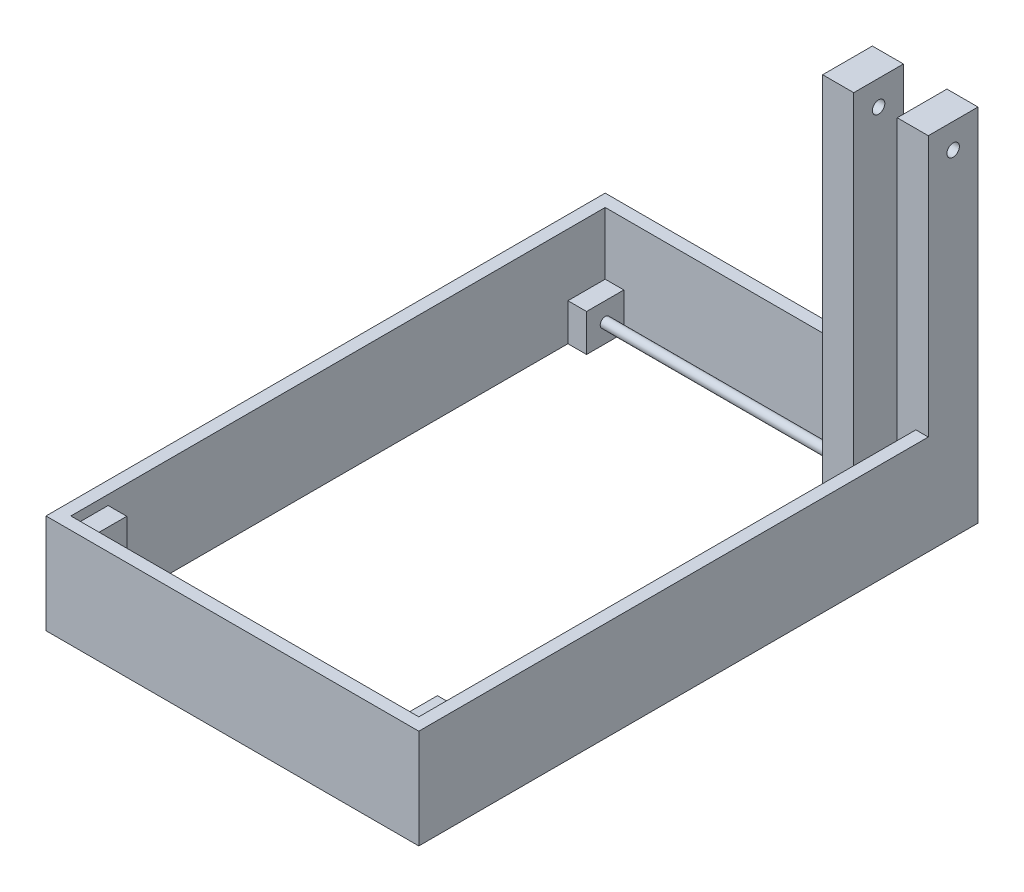
ISO-10303-21;
HEADER;
FILE_DESCRIPTION(('STEP AP214'),'2;1');
FILE_NAME('part.step','',(''),(''),'','','');
FILE_SCHEMA(('AUTOMOTIVE_DESIGN { 1 0 10303 214 1 1 1 1 }'));
ENDSEC;
DATA;
#1=APPLICATION_CONTEXT('core data for automotive mechanical design processes');
#2=APPLICATION_PROTOCOL_DEFINITION('international standard','automotive_design',2000,#1);
#3=PRODUCT_CONTEXT('',#1,'mechanical');
#4=PRODUCT('Part','Part','',(#3));
#5=PRODUCT_RELATED_PRODUCT_CATEGORY('part','',(#4));
#6=PRODUCT_DEFINITION_FORMATION('','',#4);
#7=PRODUCT_DEFINITION_CONTEXT('part definition',#1,'design');
#8=PRODUCT_DEFINITION('design','',#6,#7);
#9=PRODUCT_DEFINITION_SHAPE('','',#8);
#10=(LENGTH_UNIT() NAMED_UNIT(*) SI_UNIT(.MILLI.,.METRE.));
#11=(NAMED_UNIT(*) PLANE_ANGLE_UNIT() SI_UNIT($,.RADIAN.));
#12=(NAMED_UNIT(*) SI_UNIT($,.STERADIAN.) SOLID_ANGLE_UNIT());
#13=UNCERTAINTY_MEASURE_WITH_UNIT(LENGTH_MEASURE(1.E-05),#10,'distance_accuracy_value','');
#14=(GEOMETRIC_REPRESENTATION_CONTEXT(3) GLOBAL_UNCERTAINTY_ASSIGNED_CONTEXT((#13)) GLOBAL_UNIT_ASSIGNED_CONTEXT((#10,
#11,#12)) REPRESENTATION_CONTEXT('',''));
#15=CARTESIAN_POINT('',(0.,0.,0.));
#16=DIRECTION('',(0.,0.,1.));
#17=DIRECTION('',(1.,0.,0.));
#18=AXIS2_PLACEMENT_3D('',#15,#16,#17);
#19=CARTESIAN_POINT('',(-136.313708498985,15.,-200.));
#20=DIRECTION('',(1.,0.,0.));
#21=DIRECTION('',(0.,0.,-1.));
#22=AXIS2_PLACEMENT_3D('',#19,#20,#21);
#23=CYLINDRICAL_SURFACE('',#22,3.99999999999999);
#24=CARTESIAN_POINT('',(89.9999999999999,15.,-200.));
#25=DIRECTION('',(1.,0.,0.));
#26=DIRECTION('',(0.,0.,-1.));
#27=AXIS2_PLACEMENT_3D('',#24,#25,#26);
#28=CIRCLE('',#27,3.99999999999999);
#29=CARTESIAN_POINT('',(89.9999999999999,15.,-204.));
#30=VERTEX_POINT('',#29);
#31=EDGE_CURVE('E43',#30,#30,#28,.T.);
#32=ORIENTED_EDGE('',*,*,#31,.T.);
#33=EDGE_LOOP('',(#32));
#34=FACE_BOUND('',#33,.T.);
#35=CARTESIAN_POINT('',(125.,15.,-200.));
#36=DIRECTION('',(-1.,0.,0.));
#37=DIRECTION('',(0.,0.,1.));
#38=AXIS2_PLACEMENT_3D('',#35,#36,#37);
#39=CIRCLE('',#38,3.99999999999999);
#40=CARTESIAN_POINT('',(125.,15.,-196.));
#41=VERTEX_POINT('',#40);
#42=EDGE_CURVE('E293',#41,#41,#39,.T.);
#43=ORIENTED_EDGE('',*,*,#42,.T.);
#44=EDGE_LOOP('',(#43));
#45=FACE_BOUND('',#44,.T.);
#46=ADVANCED_FACE('F39',(#34,#45),#23,.T.);
#47=CARTESIAN_POINT('',(-150.,80.,-225.));
#48=DIRECTION('',(0.,0.,1.));
#49=DIRECTION('',(1.,0.,0.));
#50=AXIS2_PLACEMENT_3D('',#47,#48,#49);
#51=PLANE('',#50);
#52=DIRECTION('',(-1.,0.,0.));
#53=VECTOR('',#52,1.);
#54=CARTESIAN_POINT('',(-150.,0.,-225.));
#55=LINE('',#54,#53);
#56=CARTESIAN_POINT('',(150.,0.,-225.));
#57=VERTEX_POINT('',#56);
#58=CARTESIAN_POINT('',(125.,0.,-225.));
#59=VERTEX_POINT('',#58);
#60=EDGE_CURVE('E427',#57,#59,#55,.T.);
#61=ORIENTED_EDGE('',*,*,#60,.T.);
#62=DIRECTION('',(0.,1.,0.));
#63=VECTOR('',#62,1.);
#64=CARTESIAN_POINT('',(125.,-17.1699056602831,-225.));
#65=LINE('',#64,#63);
#66=CARTESIAN_POINT('',(125.,290.,-225.));
#67=VERTEX_POINT('',#66);
#68=EDGE_CURVE('E280',#59,#67,#65,.T.);
#69=ORIENTED_EDGE('',*,*,#68,.T.);
#70=DIRECTION('',(1.,0.,0.));
#71=VECTOR('',#70,1.);
#72=CARTESIAN_POINT('',(125.,290.,-225.));
#73=LINE('',#72,#71);
#74=CARTESIAN_POINT('',(150.,290.,-225.));
#75=VERTEX_POINT('',#74);
#76=EDGE_CURVE('E228',#67,#75,#73,.T.);
#77=ORIENTED_EDGE('',*,*,#76,.T.);
#78=DIRECTION('',(0.,-1.,0.));
#79=VECTOR('',#78,1.);
#80=CARTESIAN_POINT('',(150.,80.,-225.));
#81=LINE('',#80,#79);
#82=EDGE_CURVE('E446',#75,#57,#81,.T.);
#83=ORIENTED_EDGE('',*,*,#82,.T.);
#84=EDGE_LOOP('',(#61,#69,#77,#83));
#85=FACE_BOUND('',#84,.T.);
#86=ADVANCED_FACE('F499',(#85),#51,.F.);
#87=CARTESIAN_POINT('',(-150.,80.,-215.));
#88=DIRECTION('',(0.,0.,1.));
#89=DIRECTION('',(1.,0.,0.));
#90=AXIS2_PLACEMENT_3D('',#87,#88,#89);
#91=PLANE('',#90);
#92=DIRECTION('',(0.,-1.,0.));
#93=VECTOR('',#92,1.);
#94=CARTESIAN_POINT('',(64.9999999999999,80.,-215.));
#95=LINE('',#94,#93);
#96=CARTESIAN_POINT('',(64.9999999999999,80.,-215.));
#97=VERTEX_POINT('',#96);
#98=CARTESIAN_POINT('',(64.9999999999999,0.,-215.));
#99=VERTEX_POINT('',#98);
#100=EDGE_CURVE('E56',#97,#99,#95,.T.);
#101=ORIENTED_EDGE('',*,*,#100,.F.);
#102=DIRECTION('',(-1.,0.,0.));
#103=VECTOR('',#102,1.);
#104=CARTESIAN_POINT('',(-150.,80.,-215.));
#105=LINE('',#104,#103);
#106=CARTESIAN_POINT('',(-140.,80.,-215.));
#107=VERTEX_POINT('',#106);
#108=EDGE_CURVE('E403',#97,#107,#105,.T.);
#109=ORIENTED_EDGE('',*,*,#108,.T.);
#110=DIRECTION('',(0.,-1.,0.));
#111=VECTOR('',#110,1.);
#112=CARTESIAN_POINT('',(-140.,80.,-215.));
#113=LINE('',#112,#111);
#114=CARTESIAN_POINT('',(-140.,30.,-215.));
#115=VERTEX_POINT('',#114);
#116=EDGE_CURVE('E399',#107,#115,#113,.T.);
#117=ORIENTED_EDGE('',*,*,#116,.T.);
#118=DIRECTION('',(-1.,0.,0.));
#119=VECTOR('',#118,1.);
#120=CARTESIAN_POINT('',(-125.,30.,-215.));
#121=LINE('',#120,#119);
#122=CARTESIAN_POINT('',(-125.,30.,-215.));
#123=VERTEX_POINT('',#122);
#124=EDGE_CURVE('E317',#123,#115,#121,.T.);
#125=ORIENTED_EDGE('',*,*,#124,.F.);
#126=DIRECTION('',(0.,-1.,0.));
#127=VECTOR('',#126,1.);
#128=CARTESIAN_POINT('',(-125.,0.,-215.));
#129=LINE('',#128,#127);
#130=CARTESIAN_POINT('',(-125.,0.,-215.));
#131=VERTEX_POINT('',#130);
#132=EDGE_CURVE('E306',#123,#131,#129,.T.);
#133=ORIENTED_EDGE('',*,*,#132,.T.);
#134=DIRECTION('',(-1.,0.,0.));
#135=VECTOR('',#134,1.);
#136=CARTESIAN_POINT('',(-150.,0.,-215.));
#137=LINE('',#136,#135);
#138=EDGE_CURVE('E61',#99,#131,#137,.T.);
#139=ORIENTED_EDGE('',*,*,#138,.F.);
#140=EDGE_LOOP('',(#101,#109,#117,#125,#133,#139));
#141=FACE_BOUND('',#140,.T.);
#142=ADVANCED_FACE('F469',(#141),#91,.T.);
#143=CARTESIAN_POINT('',(0.,80.,0.));
#144=DIRECTION('',(0.,1.,0.));
#145=DIRECTION('',(0.,0.,1.));
#146=AXIS2_PLACEMENT_3D('',#143,#144,#145);
#147=PLANE('',#146);
#148=DIRECTION('',(0.,0.,1.));
#149=VECTOR('',#148,1.);
#150=CARTESIAN_POINT('',(64.9999999999999,80.,0.));
#151=LINE('',#150,#149);
#152=CARTESIAN_POINT('',(64.9999999999999,80.,-225.));
#153=VERTEX_POINT('',#152);
#154=EDGE_CURVE('E264',#153,#97,#151,.T.);
#155=ORIENTED_EDGE('',*,*,#154,.F.);
#156=DIRECTION('',(-1.,0.,0.));
#157=VECTOR('',#156,1.);
#158=CARTESIAN_POINT('',(-150.,80.,-225.));
#159=LINE('',#158,#157);
#160=CARTESIAN_POINT('',(-150.,80.,-225.));
#161=VERTEX_POINT('',#160);
#162=EDGE_CURVE('E431',#153,#161,#159,.T.);
#163=ORIENTED_EDGE('',*,*,#162,.T.);
#164=DIRECTION('',(0.,0.,1.));
#165=VECTOR('',#164,1.);
#166=CARTESIAN_POINT('',(-150.,80.,-225.));
#167=LINE('',#166,#165);
#168=CARTESIAN_POINT('',(-150.,80.,225.));
#169=VERTEX_POINT('',#168);
#170=EDGE_CURVE('E423',#161,#169,#167,.T.);
#171=ORIENTED_EDGE('',*,*,#170,.T.);
#172=DIRECTION('',(1.,0.,0.));
#173=VECTOR('',#172,1.);
#174=CARTESIAN_POINT('',(-150.,80.,225.));
#175=LINE('',#174,#173);
#176=CARTESIAN_POINT('',(150.,80.,225.));
#177=VERTEX_POINT('',#176);
#178=EDGE_CURVE('E426',#169,#177,#175,.T.);
#179=ORIENTED_EDGE('',*,*,#178,.T.);
#180=DIRECTION('',(0.,0.,-1.));
#181=VECTOR('',#180,1.);
#182=CARTESIAN_POINT('',(150.,80.,-225.));
#183=LINE('',#182,#181);
#184=CARTESIAN_POINT('',(150.,80.,-185.));
#185=VERTEX_POINT('',#184);
#186=EDGE_CURVE('E429',#177,#185,#183,.T.);
#187=ORIENTED_EDGE('',*,*,#186,.T.);
#188=DIRECTION('',(1.,0.,0.));
#189=VECTOR('',#188,1.);
#190=CARTESIAN_POINT('',(0.,80.,-185.));
#191=LINE('',#190,#189);
#192=CARTESIAN_POINT('',(140.,80.,-185.));
#193=VERTEX_POINT('',#192);
#194=EDGE_CURVE('E284',#193,#185,#191,.T.);
#195=ORIENTED_EDGE('',*,*,#194,.F.);
#196=DIRECTION('',(0.,0.,-1.));
#197=VECTOR('',#196,1.);
#198=CARTESIAN_POINT('',(140.,80.,-225.));
#199=LINE('',#198,#197);
#200=CARTESIAN_POINT('',(140.,80.,215.));
#201=VERTEX_POINT('',#200);
#202=EDGE_CURVE('E419',#201,#193,#199,.T.);
#203=ORIENTED_EDGE('',*,*,#202,.F.);
#204=DIRECTION('',(1.,0.,0.));
#205=VECTOR('',#204,1.);
#206=CARTESIAN_POINT('',(-150.,80.,215.));
#207=LINE('',#206,#205);
#208=CARTESIAN_POINT('',(-140.,80.,215.));
#209=VERTEX_POINT('',#208);
#210=EDGE_CURVE('E417',#209,#201,#207,.T.);
#211=ORIENTED_EDGE('',*,*,#210,.F.);
#212=DIRECTION('',(0.,0.,1.));
#213=VECTOR('',#212,1.);
#214=CARTESIAN_POINT('',(-140.,80.,-225.));
#215=LINE('',#214,#213);
#216=EDGE_CURVE('E410',#107,#209,#215,.T.);
#217=ORIENTED_EDGE('',*,*,#216,.F.);
#218=ORIENTED_EDGE('',*,*,#108,.F.);
#219=EDGE_LOOP('',(#155,#163,#171,#179,#187,#195,#203,#211,#217,#218));
#220=FACE_BOUND('',#219,.T.);
#221=ADVANCED_FACE('F464',(#220),#147,.T.);
#222=CARTESIAN_POINT('',(-140.,80.,-225.));
#223=DIRECTION('',(1.,0.,0.));
#224=DIRECTION('',(0.,0.,-1.));
#225=AXIS2_PLACEMENT_3D('',#222,#223,#224);
#226=PLANE('',#225);
#227=DIRECTION('',(0.,0.,1.));
#228=VECTOR('',#227,1.);
#229=CARTESIAN_POINT('',(-140.,0.,-225.));
#230=LINE('',#229,#228);
#231=CARTESIAN_POINT('',(-140.,0.,-185.));
#232=VERTEX_POINT('',#231);
#233=CARTESIAN_POINT('',(-140.,0.,215.));
#234=VERTEX_POINT('',#233);
#235=EDGE_CURVE('E393',#232,#234,#230,.T.);
#236=ORIENTED_EDGE('',*,*,#235,.F.);
#237=DIRECTION('',(0.,-1.,0.));
#238=VECTOR('',#237,1.);
#239=CARTESIAN_POINT('',(-140.,0.,-185.));
#240=LINE('',#239,#238);
#241=CARTESIAN_POINT('',(-140.,30.,-185.));
#242=VERTEX_POINT('',#241);
#243=EDGE_CURVE('E299',#242,#232,#240,.T.);
#244=ORIENTED_EDGE('',*,*,#243,.F.);
#245=DIRECTION('',(0.,0.,1.));
#246=VECTOR('',#245,1.);
#247=CARTESIAN_POINT('',(-140.,30.,0.));
#248=LINE('',#247,#246);
#249=EDGE_CURVE('E303',#115,#242,#248,.T.);
#250=ORIENTED_EDGE('',*,*,#249,.F.);
#251=ORIENTED_EDGE('',*,*,#116,.F.);
#252=ORIENTED_EDGE('',*,*,#216,.T.);
#253=DIRECTION('',(0.,-1.,0.));
#254=VECTOR('',#253,1.);
#255=CARTESIAN_POINT('',(-140.,80.,215.));
#256=LINE('',#255,#254);
#257=CARTESIAN_POINT('',(-140.,72.2743413073772,215.));
#258=VERTEX_POINT('',#257);
#259=EDGE_CURVE('E394',#209,#258,#256,.T.);
#260=ORIENTED_EDGE('',*,*,#259,.T.);
#261=DIRECTION('',(0.,0.,1.));
#262=VECTOR('',#261,1.);
#263=CARTESIAN_POINT('',(-140.,72.2743413073772,0.));
#264=LINE('',#263,#262);
#265=CARTESIAN_POINT('',(-140.,72.2743413073772,185.));
#266=VERTEX_POINT('',#265);
#267=EDGE_CURVE('E338',#266,#258,#264,.T.);
#268=ORIENTED_EDGE('',*,*,#267,.F.);
#269=DIRECTION('',(0.,-1.,0.));
#270=VECTOR('',#269,1.);
#271=CARTESIAN_POINT('',(-140.,0.,185.));
#272=LINE('',#271,#270);
#273=CARTESIAN_POINT('',(-140.,42.2743413073772,185.));
#274=VERTEX_POINT('',#273);
#275=EDGE_CURVE('E323',#266,#274,#272,.T.);
#276=ORIENTED_EDGE('',*,*,#275,.T.);
#277=DIRECTION('',(0.,0.,1.));
#278=VECTOR('',#277,1.);
#279=CARTESIAN_POINT('',(-140.,42.2743413073772,0.));
#280=LINE('',#279,#278);
#281=CARTESIAN_POINT('',(-140.,42.2743413073772,215.));
#282=VERTEX_POINT('',#281);
#283=EDGE_CURVE('E328',#274,#282,#280,.T.);
#284=ORIENTED_EDGE('',*,*,#283,.T.);
#285=EDGE_CURVE('E398',#282,#234,#256,.T.);
#286=ORIENTED_EDGE('',*,*,#285,.T.);
#287=EDGE_LOOP('',(#236,#244,#250,#251,#252,#260,#268,#276,#284,#286));
#288=FACE_BOUND('',#287,.T.);
#289=ADVANCED_FACE('F471',(#288),#226,.T.);
#290=CARTESIAN_POINT('',(-150.,80.,215.));
#291=DIRECTION('',(0.,0.,-1.));
#292=DIRECTION('',(-1.,0.,0.));
#293=AXIS2_PLACEMENT_3D('',#290,#291,#292);
#294=PLANE('',#293);
#295=DIRECTION('',(0.,1.,0.));
#296=VECTOR('',#295,1.);
#297=CARTESIAN_POINT('',(-125.,0.,215.));
#298=LINE('',#297,#296);
#299=CARTESIAN_POINT('',(-125.,42.2743413073772,215.));
#300=VERTEX_POINT('',#299);
#301=CARTESIAN_POINT('',(-125.,72.2743413073772,215.));
#302=VERTEX_POINT('',#301);
#303=EDGE_CURVE('E331',#300,#302,#298,.T.);
#304=ORIENTED_EDGE('',*,*,#303,.T.);
#305=DIRECTION('',(-1.,0.,0.));
#306=VECTOR('',#305,1.);
#307=CARTESIAN_POINT('',(-125.,72.2743413073772,215.));
#308=LINE('',#307,#306);
#309=EDGE_CURVE('E347',#302,#258,#308,.T.);
#310=ORIENTED_EDGE('',*,*,#309,.T.);
#311=ORIENTED_EDGE('',*,*,#259,.F.);
#312=ORIENTED_EDGE('',*,*,#210,.T.);
#313=DIRECTION('',(0.,-1.,0.));
#314=VECTOR('',#313,1.);
#315=CARTESIAN_POINT('',(140.,80.,215.));
#316=LINE('',#315,#314);
#317=CARTESIAN_POINT('',(140.,72.2743413073772,215.));
#318=VERTEX_POINT('',#317);
#319=EDGE_CURVE('E404',#201,#318,#316,.T.);
#320=ORIENTED_EDGE('',*,*,#319,.T.);
#321=DIRECTION('',(1.,0.,0.));
#322=VECTOR('',#321,1.);
#323=CARTESIAN_POINT('',(125.,72.2743413073772,215.));
#324=LINE('',#323,#322);
#325=CARTESIAN_POINT('',(125.,72.2743413073772,215.));
#326=VERTEX_POINT('',#325);
#327=EDGE_CURVE('E385',#326,#318,#324,.T.);
#328=ORIENTED_EDGE('',*,*,#327,.F.);
#329=DIRECTION('',(0.,1.,0.));
#330=VECTOR('',#329,1.);
#331=CARTESIAN_POINT('',(125.,0.,215.));
#332=LINE('',#331,#330);
#333=CARTESIAN_POINT('',(125.,42.2743413073772,215.));
#334=VERTEX_POINT('',#333);
#335=EDGE_CURVE('E370',#334,#326,#332,.T.);
#336=ORIENTED_EDGE('',*,*,#335,.F.);
#337=DIRECTION('',(1.,0.,0.));
#338=VECTOR('',#337,1.);
#339=CARTESIAN_POINT('',(125.,42.2743413073772,215.));
#340=LINE('',#339,#338);
#341=CARTESIAN_POINT('',(140.,42.2743413073772,215.));
#342=VERTEX_POINT('',#341);
#343=EDGE_CURVE('E388',#334,#342,#340,.T.);
#344=ORIENTED_EDGE('',*,*,#343,.T.);
#345=CARTESIAN_POINT('',(140.,0.,215.));
#346=VERTEX_POINT('',#345);
#347=EDGE_CURVE('E402',#342,#346,#316,.T.);
#348=ORIENTED_EDGE('',*,*,#347,.T.);
#349=DIRECTION('',(1.,0.,0.));
#350=VECTOR('',#349,1.);
#351=CARTESIAN_POINT('',(-150.,0.,215.));
#352=LINE('',#351,#350);
#353=EDGE_CURVE('E408',#234,#346,#352,.T.);
#354=ORIENTED_EDGE('',*,*,#353,.F.);
#355=ORIENTED_EDGE('',*,*,#285,.F.);
#356=DIRECTION('',(-1.,0.,0.));
#357=VECTOR('',#356,1.);
#358=CARTESIAN_POINT('',(-125.,42.2743413073772,215.));
#359=LINE('',#358,#357);
#360=EDGE_CURVE('E344',#300,#282,#359,.T.);
#361=ORIENTED_EDGE('',*,*,#360,.F.);
#362=EDGE_LOOP('',(#304,#310,#311,#312,#320,#328,#336,#344,#348,#354,#355,#361));
#363=FACE_BOUND('',#362,.T.);
#364=ADVANCED_FACE('F570',(#363),#294,.T.);
#365=CARTESIAN_POINT('',(140.,80.,-225.));
#366=DIRECTION('',(-1.,0.,0.));
#367=DIRECTION('',(0.,0.,1.));
#368=AXIS2_PLACEMENT_3D('',#365,#366,#367);
#369=PLANE('',#368);
#370=ORIENTED_EDGE('',*,*,#202,.T.);
#371=DIRECTION('',(0.,-1.,0.));
#372=VECTOR('',#371,1.);
#373=CARTESIAN_POINT('',(140.,0.,-185.));
#374=LINE('',#373,#372);
#375=CARTESIAN_POINT('',(140.,0.,-185.));
#376=VERTEX_POINT('',#375);
#377=EDGE_CURVE('E352',#193,#376,#374,.T.);
#378=ORIENTED_EDGE('',*,*,#377,.T.);
#379=DIRECTION('',(0.,0.,-1.));
#380=VECTOR('',#379,1.);
#381=CARTESIAN_POINT('',(140.,0.,-225.));
#382=LINE('',#381,#380);
#383=EDGE_CURVE('E411',#346,#376,#382,.T.);
#384=ORIENTED_EDGE('',*,*,#383,.F.);
#385=ORIENTED_EDGE('',*,*,#347,.F.);
#386=DIRECTION('',(0.,0.,1.));
#387=VECTOR('',#386,1.);
#388=CARTESIAN_POINT('',(140.,42.2743413073772,0.));
#389=LINE('',#388,#387);
#390=CARTESIAN_POINT('',(140.,42.2743413073772,185.));
#391=VERTEX_POINT('',#390);
#392=EDGE_CURVE('E379',#391,#342,#389,.T.);
#393=ORIENTED_EDGE('',*,*,#392,.F.);
#394=DIRECTION('',(0.,-1.,0.));
#395=VECTOR('',#394,1.);
#396=CARTESIAN_POINT('',(140.,0.,185.));
#397=LINE('',#396,#395);
#398=CARTESIAN_POINT('',(140.,72.2743413073772,185.));
#399=VERTEX_POINT('',#398);
#400=EDGE_CURVE('E362',#399,#391,#397,.T.);
#401=ORIENTED_EDGE('',*,*,#400,.F.);
#402=DIRECTION('',(0.,0.,1.));
#403=VECTOR('',#402,1.);
#404=CARTESIAN_POINT('',(140.,72.2743413073772,0.));
#405=LINE('',#404,#403);
#406=EDGE_CURVE('E367',#399,#318,#405,.T.);
#407=ORIENTED_EDGE('',*,*,#406,.T.);
#408=ORIENTED_EDGE('',*,*,#319,.F.);
#409=EDGE_LOOP('',(#370,#378,#384,#385,#393,#401,#407,#408));
#410=FACE_BOUND('',#409,.T.);
#411=ADVANCED_FACE('F573',(#410),#369,.T.);
#412=CARTESIAN_POINT('',(-150.,80.,-225.));
#413=DIRECTION('',(1.,0.,0.));
#414=DIRECTION('',(0.,0.,-1.));
#415=AXIS2_PLACEMENT_3D('',#412,#413,#414);
#416=PLANE('',#415);
#417=DIRECTION('',(0.,0.,1.));
#418=VECTOR('',#417,1.);
#419=CARTESIAN_POINT('',(-150.,0.,-225.));
#420=LINE('',#419,#418);
#421=CARTESIAN_POINT('',(-150.,0.,-225.));
#422=VERTEX_POINT('',#421);
#423=CARTESIAN_POINT('',(-150.,0.,225.));
#424=VERTEX_POINT('',#423);
#425=EDGE_CURVE('E397',#422,#424,#420,.T.);
#426=ORIENTED_EDGE('',*,*,#425,.T.);
#427=DIRECTION('',(0.,-1.,0.));
#428=VECTOR('',#427,1.);
#429=CARTESIAN_POINT('',(-150.,80.,225.));
#430=LINE('',#429,#428);
#431=EDGE_CURVE('E11',#169,#424,#430,.T.);
#432=ORIENTED_EDGE('',*,*,#431,.F.);
#433=ORIENTED_EDGE('',*,*,#170,.F.);
#434=DIRECTION('',(0.,-1.,0.));
#435=VECTOR('',#434,1.);
#436=CARTESIAN_POINT('',(-150.,80.,-225.));
#437=LINE('',#436,#435);
#438=EDGE_CURVE('E433',#161,#422,#437,.T.);
#439=ORIENTED_EDGE('',*,*,#438,.T.);
#440=EDGE_LOOP('',(#426,#432,#433,#439));
#441=FACE_BOUND('',#440,.T.);
#442=ADVANCED_FACE('F41',(#441),#416,.F.);
#443=CARTESIAN_POINT('',(-150.,80.,225.));
#444=DIRECTION('',(0.,0.,-1.));
#445=DIRECTION('',(-1.,0.,0.));
#446=AXIS2_PLACEMENT_3D('',#443,#444,#445);
#447=PLANE('',#446);
#448=DIRECTION('',(1.,0.,0.));
#449=VECTOR('',#448,1.);
#450=CARTESIAN_POINT('',(-150.,0.,225.));
#451=LINE('',#450,#449);
#452=CARTESIAN_POINT('',(150.,0.,225.));
#453=VERTEX_POINT('',#452);
#454=EDGE_CURVE('E436',#424,#453,#451,.T.);
#455=ORIENTED_EDGE('',*,*,#454,.T.);
#456=DIRECTION('',(0.,-1.,0.));
#457=VECTOR('',#456,1.);
#458=CARTESIAN_POINT('',(150.,80.,225.));
#459=LINE('',#458,#457);
#460=EDGE_CURVE('E48',#177,#453,#459,.T.);
#461=ORIENTED_EDGE('',*,*,#460,.F.);
#462=ORIENTED_EDGE('',*,*,#178,.F.);
#463=ORIENTED_EDGE('',*,*,#431,.T.);
#464=EDGE_LOOP('',(#455,#461,#462,#463));
#465=FACE_BOUND('',#464,.T.);
#466=ADVANCED_FACE('F587',(#465),#447,.F.);
#467=CARTESIAN_POINT('',(150.,80.,-225.));
#468=DIRECTION('',(-1.,0.,0.));
#469=DIRECTION('',(0.,0.,1.));
#470=AXIS2_PLACEMENT_3D('',#467,#468,#469);
#471=PLANE('',#470);
#472=CARTESIAN_POINT('',(150.,270.,-205.));
#473=DIRECTION('',(-1.,0.,0.));
#474=DIRECTION('',(0.,0.,1.));
#475=AXIS2_PLACEMENT_3D('',#472,#473,#474);
#476=CIRCLE('',#475,4.99999999999999);
#477=CARTESIAN_POINT('',(150.,270.,-200.));
#478=VERTEX_POINT('',#477);
#479=EDGE_CURVE('E244',#478,#478,#476,.T.);
#480=ORIENTED_EDGE('',*,*,#479,.T.);
#481=EDGE_LOOP('',(#480));
#482=FACE_BOUND('',#481,.T.);
#483=DIRECTION('',(0.,1.,0.));
#484=VECTOR('',#483,1.);
#485=CARTESIAN_POINT('',(150.,-17.1699056602831,-185.));
#486=LINE('',#485,#484);
#487=CARTESIAN_POINT('',(150.,290.,-185.));
#488=VERTEX_POINT('',#487);
#489=EDGE_CURVE('E282',#185,#488,#486,.T.);
#490=ORIENTED_EDGE('',*,*,#489,.F.);
#491=ORIENTED_EDGE('',*,*,#186,.F.);
#492=ORIENTED_EDGE('',*,*,#460,.T.);
#493=DIRECTION('',(0.,0.,-1.));
#494=VECTOR('',#493,1.);
#495=CARTESIAN_POINT('',(150.,0.,-225.));
#496=LINE('',#495,#494);
#497=EDGE_CURVE('E438',#453,#57,#496,.T.);
#498=ORIENTED_EDGE('',*,*,#497,.T.);
#499=ORIENTED_EDGE('',*,*,#82,.F.);
#500=DIRECTION('',(0.,0.,-1.));
#501=VECTOR('',#500,1.);
#502=CARTESIAN_POINT('',(150.,290.,-185.));
#503=LINE('',#502,#501);
#504=EDGE_CURVE('E271',#488,#75,#503,.T.);
#505=ORIENTED_EDGE('',*,*,#504,.F.);
#506=EDGE_LOOP('',(#490,#491,#492,#498,#499,#505));
#507=FACE_BOUND('',#506,.T.);
#508=ADVANCED_FACE('F585',(#482,#507),#471,.F.);
#509=ORIENTED_EDGE('',*,*,#162,.F.);
#510=DIRECTION('',(0.,1.,0.));
#511=VECTOR('',#510,1.);
#512=CARTESIAN_POINT('',(64.9999999999999,-47.169905660283,-225.));
#513=LINE('',#512,#511);
#514=CARTESIAN_POINT('',(64.9999999999999,290.,-225.));
#515=VERTEX_POINT('',#514);
#516=EDGE_CURVE('E234',#153,#515,#513,.T.);
#517=ORIENTED_EDGE('',*,*,#516,.T.);
#518=DIRECTION('',(-1.,0.,0.));
#519=VECTOR('',#518,1.);
#520=CARTESIAN_POINT('',(89.9999999999999,290.,-225.));
#521=LINE('',#520,#519);
#522=CARTESIAN_POINT('',(89.9999999999999,290.,-225.));
#523=VERTEX_POINT('',#522);
#524=EDGE_CURVE('E231',#523,#515,#521,.T.);
#525=ORIENTED_EDGE('',*,*,#524,.F.);
#526=DIRECTION('',(0.,-1.,0.));
#527=VECTOR('',#526,1.);
#528=CARTESIAN_POINT('',(90.,80.,-225.));
#529=LINE('',#528,#527);
#530=CARTESIAN_POINT('',(90.,0.,-225.));
#531=VERTEX_POINT('',#530);
#532=EDGE_CURVE('E218',#523,#531,#529,.T.);
#533=ORIENTED_EDGE('',*,*,#532,.T.);
#534=EDGE_CURVE('E441',#531,#422,#55,.T.);
#535=ORIENTED_EDGE('',*,*,#534,.T.);
#536=ORIENTED_EDGE('',*,*,#438,.F.);
#537=EDGE_LOOP('',(#509,#517,#525,#533,#535,#536));
#538=FACE_BOUND('',#537,.T.);
#539=ADVANCED_FACE('F232',(#538),#51,.F.);
#540=CARTESIAN_POINT('',(0.,0.,0.));
#541=DIRECTION('',(0.,1.,0.));
#542=DIRECTION('',(0.,0.,1.));
#543=AXIS2_PLACEMENT_3D('',#540,#541,#542);
#544=PLANE('',#543);
#545=ORIENTED_EDGE('',*,*,#425,.F.);
#546=ORIENTED_EDGE('',*,*,#534,.F.);
#547=DIRECTION('',(0.,0.,1.));
#548=VECTOR('',#547,1.);
#549=CARTESIAN_POINT('',(90.,0.,-515.));
#550=LINE('',#549,#548);
#551=CARTESIAN_POINT('',(89.9999999999999,0.,-185.));
#552=VERTEX_POINT('',#551);
#553=EDGE_CURVE('E225',#531,#552,#550,.T.);
#554=ORIENTED_EDGE('',*,*,#553,.T.);
#555=DIRECTION('',(-1.,0.,0.));
#556=VECTOR('',#555,1.);
#557=CARTESIAN_POINT('',(89.9999999999999,0.,-185.));
#558=LINE('',#557,#556);
#559=CARTESIAN_POINT('',(64.9999999999999,0.,-185.));
#560=VERTEX_POINT('',#559);
#561=EDGE_CURVE('E256',#552,#560,#558,.T.);
#562=ORIENTED_EDGE('',*,*,#561,.T.);
#563=DIRECTION('',(0.,0.,-1.));
#564=VECTOR('',#563,1.);
#565=CARTESIAN_POINT('',(64.9999999999999,0.,-225.));
#566=LINE('',#565,#564);
#567=EDGE_CURVE('E253',#560,#99,#566,.T.);
#568=ORIENTED_EDGE('',*,*,#567,.T.);
#569=ORIENTED_EDGE('',*,*,#138,.T.);
#570=DIRECTION('',(0.,0.,1.));
#571=VECTOR('',#570,1.);
#572=CARTESIAN_POINT('',(-125.,0.,0.));
#573=LINE('',#572,#571);
#574=CARTESIAN_POINT('',(-125.,0.,-185.));
#575=VERTEX_POINT('',#574);
#576=EDGE_CURVE('E302',#131,#575,#573,.T.);
#577=ORIENTED_EDGE('',*,*,#576,.T.);
#578=DIRECTION('',(-1.,0.,0.));
#579=VECTOR('',#578,1.);
#580=CARTESIAN_POINT('',(-125.,0.,-185.));
#581=LINE('',#580,#579);
#582=EDGE_CURVE('E320',#575,#232,#581,.T.);
#583=ORIENTED_EDGE('',*,*,#582,.T.);
#584=ORIENTED_EDGE('',*,*,#235,.T.);
#585=ORIENTED_EDGE('',*,*,#353,.T.);
#586=ORIENTED_EDGE('',*,*,#383,.T.);
#587=DIRECTION('',(1.,0.,0.));
#588=VECTOR('',#587,1.);
#589=CARTESIAN_POINT('',(125.,0.,-185.));
#590=LINE('',#589,#588);
#591=CARTESIAN_POINT('',(125.,0.,-185.));
#592=VERTEX_POINT('',#591);
#593=EDGE_CURVE('E358',#592,#376,#590,.T.);
#594=ORIENTED_EDGE('',*,*,#593,.F.);
#595=DIRECTION('',(0.,0.,1.));
#596=VECTOR('',#595,1.);
#597=CARTESIAN_POINT('',(125.,0.,0.));
#598=LINE('',#597,#596);
#599=EDGE_CURVE('E356',#59,#592,#598,.T.);
#600=ORIENTED_EDGE('',*,*,#599,.F.);
#601=ORIENTED_EDGE('',*,*,#60,.F.);
#602=ORIENTED_EDGE('',*,*,#497,.F.);
#603=ORIENTED_EDGE('',*,*,#454,.F.);
#604=EDGE_LOOP('',(#545,#546,#554,#562,#568,#569,#577,#583,#584,#585,#586,#594,#600,#601,#602,#603));
#605=FACE_BOUND('',#604,.T.);
#606=ADVANCED_FACE('F487',(#605),#544,.F.);
#607=CARTESIAN_POINT('',(125.,0.,185.));
#608=DIRECTION('',(0.,0.,1.));
#609=DIRECTION('',(1.,0.,0.));
#610=AXIS2_PLACEMENT_3D('',#607,#608,#609);
#611=PLANE('',#610);
#612=ORIENTED_EDGE('',*,*,#400,.T.);
#613=DIRECTION('',(1.,0.,0.));
#614=VECTOR('',#613,1.);
#615=CARTESIAN_POINT('',(125.,42.2743413073772,185.));
#616=LINE('',#615,#614);
#617=CARTESIAN_POINT('',(125.,42.2743413073772,185.));
#618=VERTEX_POINT('',#617);
#619=EDGE_CURVE('E390',#618,#391,#616,.T.);
#620=ORIENTED_EDGE('',*,*,#619,.F.);
#621=DIRECTION('',(0.,-1.,0.));
#622=VECTOR('',#621,1.);
#623=CARTESIAN_POINT('',(125.,0.,185.));
#624=LINE('',#623,#622);
#625=CARTESIAN_POINT('',(125.,72.2743413073772,185.));
#626=VERTEX_POINT('',#625);
#627=EDGE_CURVE('E363',#626,#618,#624,.T.);
#628=ORIENTED_EDGE('',*,*,#627,.F.);
#629=DIRECTION('',(1.,0.,0.));
#630=VECTOR('',#629,1.);
#631=CARTESIAN_POINT('',(125.,72.2743413073772,185.));
#632=LINE('',#631,#630);
#633=EDGE_CURVE('E376',#626,#399,#632,.T.);
#634=ORIENTED_EDGE('',*,*,#633,.T.);
#635=EDGE_LOOP('',(#612,#620,#628,#634));
#636=FACE_BOUND('',#635,.T.);
#637=ADVANCED_FACE('F563',(#636),#611,.F.);
#638=CARTESIAN_POINT('',(125.,42.2743413073772,0.));
#639=DIRECTION('',(0.,1.,0.));
#640=DIRECTION('',(0.,0.,1.));
#641=AXIS2_PLACEMENT_3D('',#638,#639,#640);
#642=PLANE('',#641);
#643=ORIENTED_EDGE('',*,*,#392,.T.);
#644=ORIENTED_EDGE('',*,*,#343,.F.);
#645=DIRECTION('',(0.,0.,1.));
#646=VECTOR('',#645,1.);
#647=CARTESIAN_POINT('',(125.,42.2743413073772,0.));
#648=LINE('',#647,#646);
#649=EDGE_CURVE('E366',#618,#334,#648,.T.);
#650=ORIENTED_EDGE('',*,*,#649,.F.);
#651=ORIENTED_EDGE('',*,*,#619,.T.);
#652=EDGE_LOOP('',(#643,#644,#650,#651));
#653=FACE_BOUND('',#652,.T.);
#654=ADVANCED_FACE('F559',(#653),#642,.F.);
#655=CARTESIAN_POINT('',(125.,72.2743413073772,0.));
#656=DIRECTION('',(0.,1.,0.));
#657=DIRECTION('',(0.,0.,1.));
#658=AXIS2_PLACEMENT_3D('',#655,#656,#657);
#659=PLANE('',#658);
#660=ORIENTED_EDGE('',*,*,#406,.F.);
#661=ORIENTED_EDGE('',*,*,#633,.F.);
#662=DIRECTION('',(0.,0.,1.));
#663=VECTOR('',#662,1.);
#664=CARTESIAN_POINT('',(125.,72.2743413073772,0.));
#665=LINE('',#664,#663);
#666=EDGE_CURVE('E373',#626,#326,#665,.T.);
#667=ORIENTED_EDGE('',*,*,#666,.T.);
#668=ORIENTED_EDGE('',*,*,#327,.T.);
#669=EDGE_LOOP('',(#660,#661,#667,#668));
#670=FACE_BOUND('',#669,.T.);
#671=ADVANCED_FACE('F555',(#670),#659,.T.);
#672=CARTESIAN_POINT('',(125.,0.,0.));
#673=DIRECTION('',(-1.,0.,0.));
#674=DIRECTION('',(0.,0.,1.));
#675=AXIS2_PLACEMENT_3D('',#672,#673,#674);
#676=PLANE('',#675);
#677=CARTESIAN_POINT('',(125.,57.2743413073772,200.));
#678=DIRECTION('',(-1.,0.,0.));
#679=DIRECTION('',(0.,0.,1.));
#680=AXIS2_PLACEMENT_3D('',#677,#678,#679);
#681=CIRCLE('',#680,3.99999999999999);
#682=CARTESIAN_POINT('',(125.,57.2743413073772,204.));
#683=VERTEX_POINT('',#682);
#684=EDGE_CURVE('E287',#683,#683,#681,.T.);
#685=ORIENTED_EDGE('',*,*,#684,.F.);
#686=EDGE_LOOP('',(#685));
#687=FACE_BOUND('',#686,.T.);
#688=ORIENTED_EDGE('',*,*,#627,.T.);
#689=ORIENTED_EDGE('',*,*,#649,.T.);
#690=ORIENTED_EDGE('',*,*,#335,.T.);
#691=ORIENTED_EDGE('',*,*,#666,.F.);
#692=EDGE_LOOP('',(#688,#689,#690,#691));
#693=FACE_BOUND('',#692,.T.);
#694=ADVANCED_FACE('F551',(#687,#693),#676,.T.);
#695=CARTESIAN_POINT('',(125.,0.,-185.));
#696=DIRECTION('',(0.,0.,1.));
#697=DIRECTION('',(1.,0.,0.));
#698=AXIS2_PLACEMENT_3D('',#695,#696,#697);
#699=PLANE('',#698);
#700=ORIENTED_EDGE('',*,*,#377,.F.);
#701=ORIENTED_EDGE('',*,*,#194,.T.);
#702=ORIENTED_EDGE('',*,*,#489,.T.);
#703=DIRECTION('',(1.,0.,0.));
#704=VECTOR('',#703,1.);
#705=CARTESIAN_POINT('',(125.,290.,-185.));
#706=LINE('',#705,#704);
#707=CARTESIAN_POINT('',(125.,290.,-185.));
#708=VERTEX_POINT('',#707);
#709=EDGE_CURVE('E274',#708,#488,#706,.T.);
#710=ORIENTED_EDGE('',*,*,#709,.F.);
#711=DIRECTION('',(0.,-1.,0.));
#712=VECTOR('',#711,1.);
#713=CARTESIAN_POINT('',(125.,0.,-185.));
#714=LINE('',#713,#712);
#715=EDGE_CURVE('E353',#708,#592,#714,.T.);
#716=ORIENTED_EDGE('',*,*,#715,.T.);
#717=ORIENTED_EDGE('',*,*,#593,.T.);
#718=EDGE_LOOP('',(#700,#701,#702,#710,#716,#717));
#719=FACE_BOUND('',#718,.T.);
#720=ADVANCED_FACE('F547',(#719),#699,.T.);
#721=CARTESIAN_POINT('',(125.,0.,0.));
#722=DIRECTION('',(-1.,0.,0.));
#723=DIRECTION('',(0.,0.,1.));
#724=AXIS2_PLACEMENT_3D('',#721,#722,#723);
#725=PLANE('',#724);
#726=CARTESIAN_POINT('',(125.,270.,-205.));
#727=DIRECTION('',(-1.,0.,0.));
#728=DIRECTION('',(0.,0.,1.));
#729=AXIS2_PLACEMENT_3D('',#726,#727,#728);
#730=CIRCLE('',#729,4.99999999999999);
#731=CARTESIAN_POINT('',(125.,270.,-200.));
#732=VERTEX_POINT('',#731);
#733=EDGE_CURVE('E247',#732,#732,#730,.T.);
#734=ORIENTED_EDGE('',*,*,#733,.F.);
#735=EDGE_LOOP('',(#734));
#736=FACE_BOUND('',#735,.T.);
#737=ORIENTED_EDGE('',*,*,#68,.F.);
#738=ORIENTED_EDGE('',*,*,#599,.T.);
#739=ORIENTED_EDGE('',*,*,#715,.F.);
#740=DIRECTION('',(0.,0.,-1.));
#741=VECTOR('',#740,1.);
#742=CARTESIAN_POINT('',(125.,290.,-185.));
#743=LINE('',#742,#741);
#744=EDGE_CURVE('E277',#708,#67,#743,.T.);
#745=ORIENTED_EDGE('',*,*,#744,.T.);
#746=EDGE_LOOP('',(#737,#738,#739,#745));
#747=FACE_BOUND('',#746,.T.);
#748=ORIENTED_EDGE('',*,*,#42,.F.);
#749=EDGE_LOOP('',(#748));
#750=FACE_BOUND('',#749,.T.);
#751=ADVANCED_FACE('F543',(#736,#747,#750),#725,.T.);
#752=CARTESIAN_POINT('',(-125.,0.,185.));
#753=DIRECTION('',(0.,0.,-1.));
#754=DIRECTION('',(-1.,0.,0.));
#755=AXIS2_PLACEMENT_3D('',#752,#753,#754);
#756=PLANE('',#755);
#757=ORIENTED_EDGE('',*,*,#275,.F.);
#758=DIRECTION('',(-1.,0.,0.));
#759=VECTOR('',#758,1.);
#760=CARTESIAN_POINT('',(-125.,72.2743413073772,185.));
#761=LINE('',#760,#759);
#762=CARTESIAN_POINT('',(-125.,72.2743413073772,185.));
#763=VERTEX_POINT('',#762);
#764=EDGE_CURVE('E349',#763,#266,#761,.T.);
#765=ORIENTED_EDGE('',*,*,#764,.F.);
#766=DIRECTION('',(0.,-1.,0.));
#767=VECTOR('',#766,1.);
#768=CARTESIAN_POINT('',(-125.,0.,185.));
#769=LINE('',#768,#767);
#770=CARTESIAN_POINT('',(-125.,42.2743413073772,185.));
#771=VERTEX_POINT('',#770);
#772=EDGE_CURVE('E324',#763,#771,#769,.T.);
#773=ORIENTED_EDGE('',*,*,#772,.T.);
#774=DIRECTION('',(-1.,0.,0.));
#775=VECTOR('',#774,1.);
#776=CARTESIAN_POINT('',(-125.,42.2743413073772,185.));
#777=LINE('',#776,#775);
#778=EDGE_CURVE('E336',#771,#274,#777,.T.);
#779=ORIENTED_EDGE('',*,*,#778,.T.);
#780=EDGE_LOOP('',(#757,#765,#773,#779));
#781=FACE_BOUND('',#780,.T.);
#782=ADVANCED_FACE('F539',(#781),#756,.T.);
#783=CARTESIAN_POINT('',(-125.,72.2743413073772,0.));
#784=DIRECTION('',(0.,-1.,0.));
#785=DIRECTION('',(0.,0.,-1.));
#786=AXIS2_PLACEMENT_3D('',#783,#784,#785);
#787=PLANE('',#786);
#788=ORIENTED_EDGE('',*,*,#267,.T.);
#789=ORIENTED_EDGE('',*,*,#309,.F.);
#790=DIRECTION('',(0.,0.,1.));
#791=VECTOR('',#790,1.);
#792=CARTESIAN_POINT('',(-125.,72.2743413073772,0.));
#793=LINE('',#792,#791);
#794=EDGE_CURVE('E327',#763,#302,#793,.T.);
#795=ORIENTED_EDGE('',*,*,#794,.F.);
#796=ORIENTED_EDGE('',*,*,#764,.T.);
#797=EDGE_LOOP('',(#788,#789,#795,#796));
#798=FACE_BOUND('',#797,.T.);
#799=ADVANCED_FACE('F535',(#798),#787,.F.);
#800=CARTESIAN_POINT('',(-125.,42.2743413073772,0.));
#801=DIRECTION('',(0.,-1.,0.));
#802=DIRECTION('',(0.,0.,-1.));
#803=AXIS2_PLACEMENT_3D('',#800,#801,#802);
#804=PLANE('',#803);
#805=ORIENTED_EDGE('',*,*,#283,.F.);
#806=ORIENTED_EDGE('',*,*,#778,.F.);
#807=DIRECTION('',(0.,0.,1.));
#808=VECTOR('',#807,1.);
#809=CARTESIAN_POINT('',(-125.,42.2743413073772,0.));
#810=LINE('',#809,#808);
#811=EDGE_CURVE('E333',#771,#300,#810,.T.);
#812=ORIENTED_EDGE('',*,*,#811,.T.);
#813=ORIENTED_EDGE('',*,*,#360,.T.);
#814=EDGE_LOOP('',(#805,#806,#812,#813));
#815=FACE_BOUND('',#814,.T.);
#816=ADVANCED_FACE('F531',(#815),#804,.T.);
#817=CARTESIAN_POINT('',(-125.,0.,0.));
#818=DIRECTION('',(1.,0.,0.));
#819=DIRECTION('',(0.,0.,1.));
#820=AXIS2_PLACEMENT_3D('',#817,#818,#819);
#821=PLANE('',#820);
#822=CARTESIAN_POINT('',(-125.,57.2743413073772,200.));
#823=DIRECTION('',(1.,0.,0.));
#824=DIRECTION('',(0.,0.,-1.));
#825=AXIS2_PLACEMENT_3D('',#822,#823,#824);
#826=CIRCLE('',#825,3.99999999999999);
#827=CARTESIAN_POINT('',(-125.,57.2743413073772,196.));
#828=VERTEX_POINT('',#827);
#829=EDGE_CURVE('E290',#828,#828,#826,.T.);
#830=ORIENTED_EDGE('',*,*,#829,.F.);
#831=EDGE_LOOP('',(#830));
#832=FACE_BOUND('',#831,.T.);
#833=ORIENTED_EDGE('',*,*,#772,.F.);
#834=ORIENTED_EDGE('',*,*,#794,.T.);
#835=ORIENTED_EDGE('',*,*,#303,.F.);
#836=ORIENTED_EDGE('',*,*,#811,.F.);
#837=EDGE_LOOP('',(#833,#834,#835,#836));
#838=FACE_BOUND('',#837,.T.);
#839=ADVANCED_FACE('F528',(#832,#838),#821,.T.);
#840=CARTESIAN_POINT('',(-125.,0.,-185.));
#841=DIRECTION('',(0.,0.,-1.));
#842=DIRECTION('',(-1.,0.,0.));
#843=AXIS2_PLACEMENT_3D('',#840,#841,#842);
#844=PLANE('',#843);
#845=ORIENTED_EDGE('',*,*,#243,.T.);
#846=ORIENTED_EDGE('',*,*,#582,.F.);
#847=DIRECTION('',(0.,-1.,0.));
#848=VECTOR('',#847,1.);
#849=CARTESIAN_POINT('',(-125.,0.,-185.));
#850=LINE('',#849,#848);
#851=CARTESIAN_POINT('',(-125.,30.,-185.));
#852=VERTEX_POINT('',#851);
#853=EDGE_CURVE('E300',#852,#575,#850,.T.);
#854=ORIENTED_EDGE('',*,*,#853,.F.);
#855=DIRECTION('',(-1.,0.,0.));
#856=VECTOR('',#855,1.);
#857=CARTESIAN_POINT('',(-125.,30.,-185.));
#858=LINE('',#857,#856);
#859=EDGE_CURVE('E310',#852,#242,#858,.T.);
#860=ORIENTED_EDGE('',*,*,#859,.T.);
#861=EDGE_LOOP('',(#845,#846,#854,#860));
#862=FACE_BOUND('',#861,.T.);
#863=ADVANCED_FACE('F479',(#862),#844,.F.);
#864=CARTESIAN_POINT('',(-125.,30.,0.));
#865=DIRECTION('',(0.,-1.,0.));
#866=DIRECTION('',(0.,0.,-1.));
#867=AXIS2_PLACEMENT_3D('',#864,#865,#866);
#868=PLANE('',#867);
#869=ORIENTED_EDGE('',*,*,#249,.T.);
#870=ORIENTED_EDGE('',*,*,#859,.F.);
#871=DIRECTION('',(0.,0.,1.));
#872=VECTOR('',#871,1.);
#873=CARTESIAN_POINT('',(-125.,30.,0.));
#874=LINE('',#873,#872);
#875=EDGE_CURVE('E308',#123,#852,#874,.T.);
#876=ORIENTED_EDGE('',*,*,#875,.F.);
#877=ORIENTED_EDGE('',*,*,#124,.T.);
#878=EDGE_LOOP('',(#869,#870,#876,#877));
#879=FACE_BOUND('',#878,.T.);
#880=ADVANCED_FACE('F475',(#879),#868,.F.);
#881=CARTESIAN_POINT('',(-125.,0.,0.));
#882=DIRECTION('',(1.,0.,0.));
#883=DIRECTION('',(0.,0.,1.));
#884=AXIS2_PLACEMENT_3D('',#881,#882,#883);
#885=PLANE('',#884);
#886=CARTESIAN_POINT('',(-125.,15.,-200.));
#887=DIRECTION('',(1.,0.,0.));
#888=DIRECTION('',(0.,0.,-1.));
#889=AXIS2_PLACEMENT_3D('',#886,#887,#888);
#890=CIRCLE('',#889,3.99999999999999);
#891=CARTESIAN_POINT('',(-125.,15.,-204.));
#892=VERTEX_POINT('',#891);
#893=EDGE_CURVE('E296',#892,#892,#890,.T.);
#894=ORIENTED_EDGE('',*,*,#893,.F.);
#895=EDGE_LOOP('',(#894));
#896=FACE_BOUND('',#895,.T.);
#897=ORIENTED_EDGE('',*,*,#853,.T.);
#898=ORIENTED_EDGE('',*,*,#576,.F.);
#899=ORIENTED_EDGE('',*,*,#132,.F.);
#900=ORIENTED_EDGE('',*,*,#875,.T.);
#901=EDGE_LOOP('',(#897,#898,#899,#900));
#902=FACE_BOUND('',#901,.T.);
#903=ADVANCED_FACE('F483',(#896,#902),#885,.T.);
#904=CARTESIAN_POINT('',(64.9999999999999,15.,-200.));
#905=DIRECTION('',(-1.,0.,0.));
#906=DIRECTION('',(0.,0.,1.));
#907=AXIS2_PLACEMENT_3D('',#904,#905,#906);
#908=CIRCLE('',#907,3.99999999999999);
#909=CARTESIAN_POINT('',(64.9999999999999,15.,-196.));
#910=VERTEX_POINT('',#909);
#911=EDGE_CURVE('E259',#910,#910,#908,.T.);
#912=ORIENTED_EDGE('',*,*,#911,.T.);
#913=EDGE_LOOP('',(#912));
#914=FACE_BOUND('',#913,.T.);
#915=ORIENTED_EDGE('',*,*,#893,.T.);
#916=EDGE_LOOP('',(#915));
#917=FACE_BOUND('',#916,.T.);
#918=ADVANCED_FACE('F452',(#914,#917),#23,.T.);
#919=CARTESIAN_POINT('',(-136.313708498985,57.2743413073772,200.));
#920=DIRECTION('',(1.,0.,0.));
#921=DIRECTION('',(0.,0.,-1.));
#922=AXIS2_PLACEMENT_3D('',#919,#920,#921);
#923=CYLINDRICAL_SURFACE('',#922,3.99999999999999);
#924=ORIENTED_EDGE('',*,*,#829,.T.);
#925=EDGE_LOOP('',(#924));
#926=FACE_BOUND('',#925,.T.);
#927=ORIENTED_EDGE('',*,*,#684,.T.);
#928=EDGE_LOOP('',(#927));
#929=FACE_BOUND('',#928,.T.);
#930=ADVANCED_FACE('F512',(#926,#929),#923,.T.);
#931=CARTESIAN_POINT('',(0.,290.,0.));
#932=DIRECTION('',(0.,1.,0.));
#933=DIRECTION('',(0.,0.,1.));
#934=AXIS2_PLACEMENT_3D('',#931,#932,#933);
#935=PLANE('',#934);
#936=ORIENTED_EDGE('',*,*,#76,.F.);
#937=ORIENTED_EDGE('',*,*,#744,.F.);
#938=ORIENTED_EDGE('',*,*,#709,.T.);
#939=ORIENTED_EDGE('',*,*,#504,.T.);
#940=EDGE_LOOP('',(#936,#937,#938,#939));
#941=FACE_BOUND('',#940,.T.);
#942=ADVANCED_FACE('F517',(#941),#935,.T.);
#943=CARTESIAN_POINT('',(90.,0.,-515.));
#944=DIRECTION('',(-1.,0.,0.));
#945=DIRECTION('',(0.,-1.,0.));
#946=AXIS2_PLACEMENT_3D('',#943,#944,#945);
#947=PLANE('',#946);
#948=CARTESIAN_POINT('',(89.9999999999999,270.,-205.));
#949=DIRECTION('',(-1.,0.,0.));
#950=DIRECTION('',(0.,-1.,0.));
#951=AXIS2_PLACEMENT_3D('',#948,#949,#950);
#952=CIRCLE('',#951,4.99999999999999);
#953=CARTESIAN_POINT('',(89.9999999999999,265.,-205.));
#954=VERTEX_POINT('',#953);
#955=EDGE_CURVE('E646',#954,#954,#952,.T.);
#956=ORIENTED_EDGE('',*,*,#955,.T.);
#957=EDGE_LOOP('',(#956));
#958=FACE_BOUND('',#957,.T.);
#959=DIRECTION('',(0.,1.,0.));
#960=VECTOR('',#959,1.);
#961=CARTESIAN_POINT('',(89.9999999999999,-47.169905660283,-185.));
#962=LINE('',#961,#960);
#963=CARTESIAN_POINT('',(89.9999999999999,290.,-185.));
#964=VERTEX_POINT('',#963);
#965=EDGE_CURVE('E257',#552,#964,#962,.T.);
#966=ORIENTED_EDGE('',*,*,#965,.F.);
#967=ORIENTED_EDGE('',*,*,#553,.F.);
#968=ORIENTED_EDGE('',*,*,#532,.F.);
#969=DIRECTION('',(0.,0.,-1.));
#970=VECTOR('',#969,1.);
#971=CARTESIAN_POINT('',(89.9999999999999,290.,-225.));
#972=LINE('',#971,#970);
#973=EDGE_CURVE('E224',#964,#523,#972,.T.);
#974=ORIENTED_EDGE('',*,*,#973,.F.);
#975=EDGE_LOOP('',(#966,#967,#968,#974));
#976=FACE_BOUND('',#975,.T.);
#977=ORIENTED_EDGE('',*,*,#31,.F.);
#978=EDGE_LOOP('',(#977));
#979=FACE_BOUND('',#978,.T.);
#980=ADVANCED_FACE('F221',(#958,#976,#979),#947,.F.);
#981=CARTESIAN_POINT('',(64.9999999999999,-47.169905660283,-225.));
#982=DIRECTION('',(-1.,0.,0.));
#983=DIRECTION('',(0.,0.,1.));
#984=AXIS2_PLACEMENT_3D('',#981,#982,#983);
#985=PLANE('',#984);
#986=CARTESIAN_POINT('',(64.9999999999999,270.,-205.));
#987=DIRECTION('',(-1.,0.,0.));
#988=DIRECTION('',(0.,0.,1.));
#989=AXIS2_PLACEMENT_3D('',#986,#987,#988);
#990=CIRCLE('',#989,4.99999999999999);
#991=CARTESIAN_POINT('',(64.9999999999999,270.,-200.));
#992=VERTEX_POINT('',#991);
#993=EDGE_CURVE('E648',#992,#992,#990,.T.);
#994=ORIENTED_EDGE('',*,*,#993,.F.);
#995=EDGE_LOOP('',(#994));
#996=FACE_BOUND('',#995,.T.);
#997=ORIENTED_EDGE('',*,*,#911,.F.);
#998=EDGE_LOOP('',(#997));
#999=FACE_BOUND('',#998,.T.);
#1000=ORIENTED_EDGE('',*,*,#154,.T.);
#1001=ORIENTED_EDGE('',*,*,#100,.T.);
#1002=ORIENTED_EDGE('',*,*,#567,.F.);
#1003=DIRECTION('',(0.,1.,0.));
#1004=VECTOR('',#1003,1.);
#1005=CARTESIAN_POINT('',(64.9999999999999,-47.169905660283,-185.));
#1006=LINE('',#1005,#1004);
#1007=CARTESIAN_POINT('',(64.9999999999999,290.,-185.));
#1008=VERTEX_POINT('',#1007);
#1009=EDGE_CURVE('E261',#560,#1008,#1006,.T.);
#1010=ORIENTED_EDGE('',*,*,#1009,.T.);
#1011=DIRECTION('',(0.,0.,1.));
#1012=VECTOR('',#1011,1.);
#1013=CARTESIAN_POINT('',(64.9999999999999,290.,-225.));
#1014=LINE('',#1013,#1012);
#1015=EDGE_CURVE('E238',#515,#1008,#1014,.T.);
#1016=ORIENTED_EDGE('',*,*,#1015,.F.);
#1017=ORIENTED_EDGE('',*,*,#516,.F.);
#1018=EDGE_LOOP('',(#1000,#1001,#1002,#1010,#1016,#1017));
#1019=FACE_BOUND('',#1018,.T.);
#1020=ADVANCED_FACE('F455',(#996,#999,#1019),#985,.T.);
#1021=CARTESIAN_POINT('',(89.9999999999999,-47.169905660283,-185.));
#1022=DIRECTION('',(0.,0.,1.));
#1023=DIRECTION('',(1.,0.,0.));
#1024=AXIS2_PLACEMENT_3D('',#1021,#1022,#1023);
#1025=PLANE('',#1024);
#1026=ORIENTED_EDGE('',*,*,#561,.F.);
#1027=ORIENTED_EDGE('',*,*,#965,.T.);
#1028=DIRECTION('',(1.,0.,0.));
#1029=VECTOR('',#1028,1.);
#1030=CARTESIAN_POINT('',(89.9999999999999,290.,-185.));
#1031=LINE('',#1030,#1029);
#1032=EDGE_CURVE('E243',#1008,#964,#1031,.T.);
#1033=ORIENTED_EDGE('',*,*,#1032,.F.);
#1034=ORIENTED_EDGE('',*,*,#1009,.F.);
#1035=EDGE_LOOP('',(#1026,#1027,#1033,#1034));
#1036=FACE_BOUND('',#1035,.T.);
#1037=ADVANCED_FACE('F458',(#1036),#1025,.T.);
#1038=CARTESIAN_POINT('',(0.,290.,0.));
#1039=DIRECTION('',(0.,-1.,0.));
#1040=DIRECTION('',(0.,0.,-1.));
#1041=AXIS2_PLACEMENT_3D('',#1038,#1039,#1040);
#1042=PLANE('',#1041);
#1043=ORIENTED_EDGE('',*,*,#973,.T.);
#1044=ORIENTED_EDGE('',*,*,#524,.T.);
#1045=ORIENTED_EDGE('',*,*,#1015,.T.);
#1046=ORIENTED_EDGE('',*,*,#1032,.T.);
#1047=EDGE_LOOP('',(#1043,#1044,#1045,#1046));
#1048=FACE_BOUND('',#1047,.T.);
#1049=ADVANCED_FACE('F241',(#1048),#1042,.F.);
#1050=CARTESIAN_POINT('',(425.,270.,-205.));
#1051=DIRECTION('',(-1.,0.,0.));
#1052=DIRECTION('',(0.,0.,1.));
#1053=AXIS2_PLACEMENT_3D('',#1050,#1051,#1052);
#1054=CYLINDRICAL_SURFACE('',#1053,4.99999999999999);
#1055=ORIENTED_EDGE('',*,*,#993,.T.);
#1056=EDGE_LOOP('',(#1055));
#1057=FACE_BOUND('',#1056,.T.);
#1058=ORIENTED_EDGE('',*,*,#955,.F.);
#1059=EDGE_LOOP('',(#1058));
#1060=FACE_BOUND('',#1059,.T.);
#1061=ADVANCED_FACE('F496',(#1057,#1060),#1054,.F.);
#1062=ORIENTED_EDGE('',*,*,#733,.T.);
#1063=EDGE_LOOP('',(#1062));
#1064=FACE_BOUND('',#1063,.T.);
#1065=ORIENTED_EDGE('',*,*,#479,.F.);
#1066=EDGE_LOOP('',(#1065));
#1067=FACE_BOUND('',#1066,.T.);
#1068=ADVANCED_FACE('F656',(#1064,#1067),#1054,.F.);
#1069=CLOSED_SHELL('',(#46,#86,#142,#221,#289,#364,#411,#442,#466,#508,#539,#606,#637,#654,#671,
#694,#720,#751,#782,#799,#816,#839,#863,#880,#903,#918,#930,#942,#980,#1020,#1037,#1049,#1061,#1068));
#1070=MANIFOLD_SOLID_BREP('B2',#1069);
#1071=ADVANCED_BREP_SHAPE_REPRESENTATION('',(#18,#1070),#14);
#1072=SHAPE_DEFINITION_REPRESENTATION(#9,#1071);
ENDSEC;
END-ISO-10303-21;
